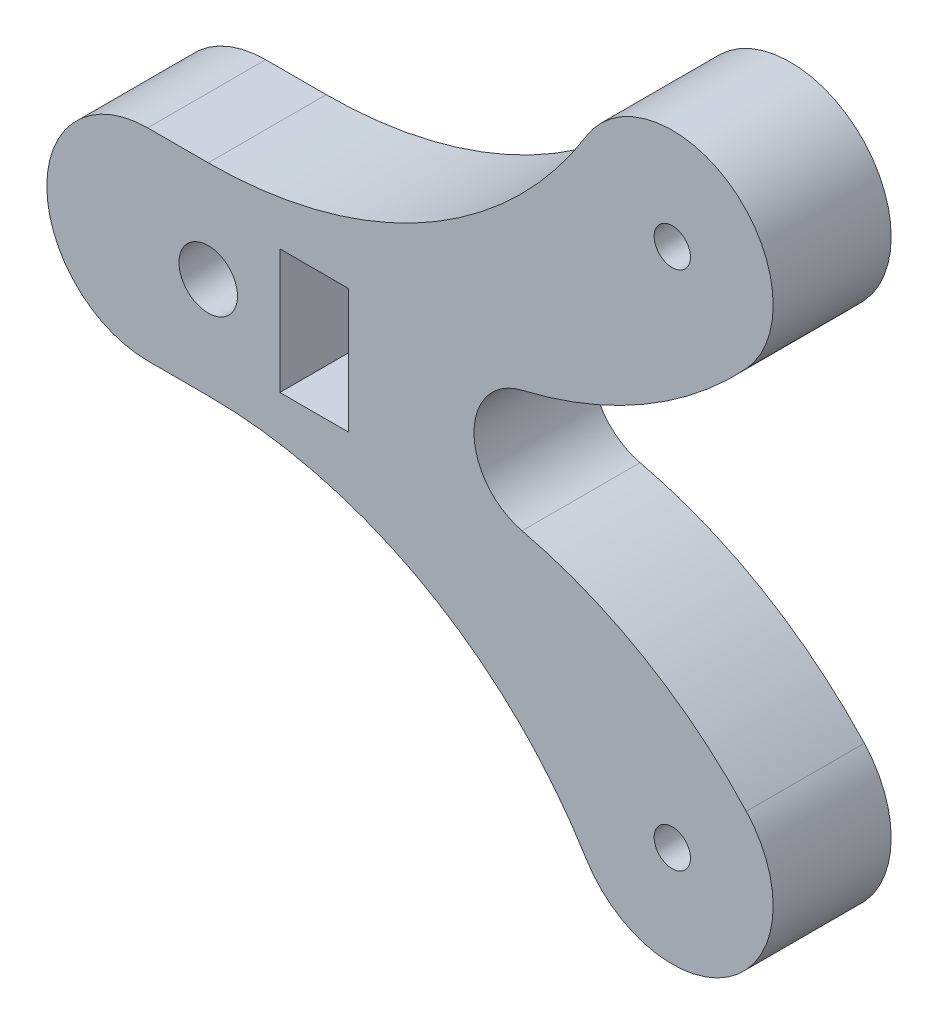
ISO-10303-21;
HEADER;
FILE_DESCRIPTION(('STEP AP214'),'2;1');
FILE_NAME('part.step','',(''),(''),'','','');
FILE_SCHEMA(('AUTOMOTIVE_DESIGN { 1 0 10303 214 1 1 1 1 }'));
ENDSEC;
DATA;
#1=APPLICATION_CONTEXT('core data for automotive mechanical design processes');
#2=APPLICATION_PROTOCOL_DEFINITION('international standard','automotive_design',2000,#1);
#3=PRODUCT_CONTEXT('',#1,'mechanical');
#4=PRODUCT('Part','Part','',(#3));
#5=PRODUCT_RELATED_PRODUCT_CATEGORY('part','',(#4));
#6=PRODUCT_DEFINITION_FORMATION('','',#4);
#7=PRODUCT_DEFINITION_CONTEXT('part definition',#1,'design');
#8=PRODUCT_DEFINITION('design','',#6,#7);
#9=PRODUCT_DEFINITION_SHAPE('','',#8);
#10=(LENGTH_UNIT() NAMED_UNIT(*) SI_UNIT(.MILLI.,.METRE.));
#11=(NAMED_UNIT(*) PLANE_ANGLE_UNIT() SI_UNIT($,.RADIAN.));
#12=(NAMED_UNIT(*) SI_UNIT($,.STERADIAN.) SOLID_ANGLE_UNIT());
#13=UNCERTAINTY_MEASURE_WITH_UNIT(LENGTH_MEASURE(1.E-05),#10,'distance_accuracy_value','');
#14=(GEOMETRIC_REPRESENTATION_CONTEXT(3) GLOBAL_UNCERTAINTY_ASSIGNED_CONTEXT((#13)) GLOBAL_UNIT_ASSIGNED_CONTEXT((#10,
#11,#12)) REPRESENTATION_CONTEXT('',''));
#15=CARTESIAN_POINT('',(0.,0.,0.));
#16=DIRECTION('',(0.,0.,1.));
#17=DIRECTION('',(1.,0.,0.));
#18=AXIS2_PLACEMENT_3D('',#15,#16,#17);
#19=CARTESIAN_POINT('',(588.919699582057,408.411933023014,5.85));
#20=DIRECTION('',(0.,0.,-1.));
#21=DIRECTION('',(-1.,0.,0.));
#22=AXIS2_PLACEMENT_3D('',#19,#20,#21);
#23=PLANE('',#22);
#24=CARTESIAN_POINT('',(588.919699582057,435.365819013464,5.85));
#25=DIRECTION('',(0.,0.,1.));
#26=DIRECTION('',(1.,0.,0.));
#27=AXIS2_PLACEMENT_3D('',#24,#25,#26);
#28=CIRCLE('',#27,1.44981300000002);
#29=CARTESIAN_POINT('',(590.369512582057,435.365819013464,5.85));
#30=VERTEX_POINT('',#29);
#31=EDGE_CURVE('E172',#30,#30,#28,.T.);
#32=ORIENTED_EDGE('',*,*,#31,.F.);
#33=EDGE_LOOP('',(#32));
#34=FACE_BOUND('',#33,.T.);
#35=CARTESIAN_POINT('',(611.919699582057,448.265819013464,5.85));
#36=DIRECTION('',(0.,0.,1.));
#37=DIRECTION('',(1.,0.,0.));
#38=AXIS2_PLACEMENT_3D('',#35,#36,#37);
#39=CIRCLE('',#38,0.900000000000007);
#40=CARTESIAN_POINT('',(612.819699582057,448.265819013464,5.85));
#41=VERTEX_POINT('',#40);
#42=EDGE_CURVE('E184',#41,#41,#39,.T.);
#43=ORIENTED_EDGE('',*,*,#42,.F.);
#44=EDGE_LOOP('',(#43));
#45=FACE_BOUND('',#44,.T.);
#46=CARTESIAN_POINT('',(588.919699582057,408.411933023014,5.85));
#47=DIRECTION('',(0.,0.,-1.));
#48=DIRECTION('',(-1.,0.,0.));
#49=AXIS2_PLACEMENT_3D('',#46,#47,#48);
#50=CIRCLE('',#49,21.9538859904498);
#51=CARTESIAN_POINT('',(588.919699582057,430.365819013464,5.85));
#52=VERTEX_POINT('',#51);
#53=CARTESIAN_POINT('',(607.649897060832,419.864129864134,5.85));
#54=VERTEX_POINT('',#53);
#55=EDGE_CURVE('E190',#52,#54,#50,.T.);
#56=ORIENTED_EDGE('',*,*,#55,.T.);
#57=CARTESIAN_POINT('',(611.919699582057,422.465819013464,5.85));
#58=DIRECTION('',(0.,0.,1.));
#59=DIRECTION('',(1.,0.,0.));
#60=AXIS2_PLACEMENT_3D('',#57,#58,#59);
#61=CIRCLE('',#60,4.99999999999998);
#62=CARTESIAN_POINT('',(615.588112307928,425.863281018059,5.85));
#63=VERTEX_POINT('',#62);
#64=EDGE_CURVE('E193',#54,#63,#61,.T.);
#65=ORIENTED_EDGE('',*,*,#64,.T.);
#66=CARTESIAN_POINT('',(599.373615384666,410.846394605062,5.85));
#67=DIRECTION('',(0.,0.,1.));
#68=DIRECTION('',(-1.,0.,0.));
#69=AXIS2_PLACEMENT_3D('',#66,#67,#68);
#70=CIRCLE('',#69,22.1001535744733);
#71=CARTESIAN_POINT('',(604.475645294501,432.349558995785,5.85));
#72=VERTEX_POINT('',#71);
#73=EDGE_CURVE('E196',#63,#72,#70,.T.);
#74=ORIENTED_EDGE('',*,*,#73,.T.);
#75=CARTESIAN_POINT('',(605.191309675167,435.365819013464,5.85));
#76=DIRECTION('',(0.,0.,-1.));
#77=DIRECTION('',(1.,0.,0.));
#78=AXIS2_PLACEMENT_3D('',#75,#76,#77);
#79=CIRCLE('',#78,3.10000000000006);
#80=CARTESIAN_POINT('',(604.475645294501,438.382079031142,5.85));
#81=VERTEX_POINT('',#80);
#82=EDGE_CURVE('E198',#72,#81,#79,.T.);
#83=ORIENTED_EDGE('',*,*,#82,.T.);
#84=CARTESIAN_POINT('',(599.373615384666,459.885243421865,5.85));
#85=DIRECTION('',(0.,0.,1.));
#86=DIRECTION('',(1.,0.,0.));
#87=AXIS2_PLACEMENT_3D('',#84,#85,#86);
#88=CIRCLE('',#87,22.1001535744733);
#89=CARTESIAN_POINT('',(615.588112307928,444.868357008869,5.85));
#90=VERTEX_POINT('',#89);
#91=EDGE_CURVE('E200',#81,#90,#88,.T.);
#92=ORIENTED_EDGE('',*,*,#91,.T.);
#93=CARTESIAN_POINT('',(611.919699582057,448.265819013464,5.85));
#94=DIRECTION('',(0.,0.,1.));
#95=DIRECTION('',(-1.,0.,0.));
#96=AXIS2_PLACEMENT_3D('',#93,#94,#95);
#97=CIRCLE('',#96,4.99999999999998);
#98=CARTESIAN_POINT('',(607.649897060832,450.867508162793,5.85));
#99=VERTEX_POINT('',#98);
#100=EDGE_CURVE('E202',#90,#99,#97,.T.);
#101=ORIENTED_EDGE('',*,*,#100,.T.);
#102=CARTESIAN_POINT('',(588.919699582057,462.319705003914,5.85));
#103=DIRECTION('',(0.,0.,-1.));
#104=DIRECTION('',(1.,0.,0.));
#105=AXIS2_PLACEMENT_3D('',#102,#103,#104);
#106=CIRCLE('',#105,21.9538859904498);
#107=CARTESIAN_POINT('',(588.919699582057,440.365819013464,5.85));
#108=VERTEX_POINT('',#107);
#109=EDGE_CURVE('E204',#99,#108,#106,.T.);
#110=ORIENTED_EDGE('',*,*,#109,.T.);
#111=DIRECTION('',(-1.,0.,0.));
#112=VECTOR('',#111,1.);
#113=CARTESIAN_POINT('',(588.919699582057,440.365819013464,5.85));
#114=LINE('',#113,#112);
#115=CARTESIAN_POINT('',(585.919699582057,440.365819013464,5.85));
#116=VERTEX_POINT('',#115);
#117=EDGE_CURVE('E206',#108,#116,#114,.T.);
#118=ORIENTED_EDGE('',*,*,#117,.T.);
#119=CARTESIAN_POINT('',(585.919699582057,435.365819013464,5.85));
#120=DIRECTION('',(0.,0.,1.));
#121=DIRECTION('',(1.,0.,0.));
#122=AXIS2_PLACEMENT_3D('',#119,#120,#121);
#123=CIRCLE('',#122,5.);
#124=CARTESIAN_POINT('',(585.919699582057,430.365819013464,5.85));
#125=VERTEX_POINT('',#124);
#126=EDGE_CURVE('E208',#116,#125,#123,.T.);
#127=ORIENTED_EDGE('',*,*,#126,.T.);
#128=DIRECTION('',(1.,0.,0.));
#129=VECTOR('',#128,1.);
#130=CARTESIAN_POINT('',(588.919699582057,430.365819013464,5.85));
#131=LINE('',#130,#129);
#132=EDGE_CURVE('E210',#125,#52,#131,.T.);
#133=ORIENTED_EDGE('',*,*,#132,.T.);
#134=EDGE_LOOP('',(#56,#65,#74,#83,#92,#101,#110,#118,#127,#133));
#135=FACE_BOUND('',#134,.T.);
#136=CARTESIAN_POINT('',(611.919699582057,422.465819013464,5.85));
#137=DIRECTION('',(0.,0.,1.));
#138=DIRECTION('',(1.,0.,0.));
#139=AXIS2_PLACEMENT_3D('',#136,#137,#138);
#140=CIRCLE('',#139,0.900000000000007);
#141=CARTESIAN_POINT('',(612.819699582057,422.465819013464,5.85));
#142=VERTEX_POINT('',#141);
#143=EDGE_CURVE('E178',#142,#142,#140,.T.);
#144=ORIENTED_EDGE('',*,*,#143,.F.);
#145=EDGE_LOOP('',(#144));
#146=FACE_BOUND('',#145,.T.);
#147=DIRECTION('',(0.,-1.,0.));
#148=VECTOR('',#147,1.);
#149=CARTESIAN_POINT('',(592.469512582057,432.283319013464,5.85));
#150=LINE('',#149,#148);
#151=CARTESIAN_POINT('',(592.469512582057,438.448319013464,5.85));
#152=VERTEX_POINT('',#151);
#153=CARTESIAN_POINT('',(592.469512582057,432.283319013464,5.85));
#154=VERTEX_POINT('',#153);
#155=EDGE_CURVE('E136',#152,#154,#150,.T.);
#156=ORIENTED_EDGE('',*,*,#155,.F.);
#157=DIRECTION('',(-1.,0.,0.));
#158=VECTOR('',#157,1.);
#159=CARTESIAN_POINT('',(592.469512582057,438.448319013464,5.85));
#160=LINE('',#159,#158);
#161=CARTESIAN_POINT('',(595.869523582057,438.448319013464,5.85));
#162=VERTEX_POINT('',#161);
#163=EDGE_CURVE('E158',#162,#152,#160,.T.);
#164=ORIENTED_EDGE('',*,*,#163,.F.);
#165=DIRECTION('',(0.,1.,0.));
#166=VECTOR('',#165,1.);
#167=CARTESIAN_POINT('',(595.869523582057,438.448319013464,5.85));
#168=LINE('',#167,#166);
#169=CARTESIAN_POINT('',(595.869523582057,432.283319013464,5.85));
#170=VERTEX_POINT('',#169);
#171=EDGE_CURVE('E156',#170,#162,#168,.T.);
#172=ORIENTED_EDGE('',*,*,#171,.F.);
#173=DIRECTION('',(1.,0.,0.));
#174=VECTOR('',#173,1.);
#175=CARTESIAN_POINT('',(595.869523582057,432.283319013464,5.85));
#176=LINE('',#175,#174);
#177=EDGE_CURVE('E144',#154,#170,#176,.T.);
#178=ORIENTED_EDGE('',*,*,#177,.F.);
#179=EDGE_LOOP('',(#156,#164,#172,#178));
#180=FACE_BOUND('',#179,.T.);
#181=ADVANCED_FACE('F35',(#34,#45,#135,#146,#180),#23,.F.);
#182=CARTESIAN_POINT('',(588.919699582057,408.411933023014,0.));
#183=DIRECTION('',(0.,0.,-1.));
#184=DIRECTION('',(-1.,0.,0.));
#185=AXIS2_PLACEMENT_3D('',#182,#183,#184);
#186=PLANE('',#185);
#187=CARTESIAN_POINT('',(588.919699582057,435.365819013464,0.));
#188=DIRECTION('',(0.,0.,1.));
#189=DIRECTION('',(1.,0.,0.));
#190=AXIS2_PLACEMENT_3D('',#187,#188,#189);
#191=CIRCLE('',#190,1.44981300000002);
#192=CARTESIAN_POINT('',(590.369512582057,435.365819013464,0.));
#193=VERTEX_POINT('',#192);
#194=EDGE_CURVE('E152',#193,#193,#191,.T.);
#195=ORIENTED_EDGE('',*,*,#194,.T.);
#196=EDGE_LOOP('',(#195));
#197=FACE_BOUND('',#196,.T.);
#198=CARTESIAN_POINT('',(611.919699582057,448.265819013464,0.));
#199=DIRECTION('',(0.,0.,1.));
#200=DIRECTION('',(1.,0.,0.));
#201=AXIS2_PLACEMENT_3D('',#198,#199,#200);
#202=CIRCLE('',#201,0.900000000000007);
#203=CARTESIAN_POINT('',(612.819699582057,448.265819013464,0.));
#204=VERTEX_POINT('',#203);
#205=EDGE_CURVE('E181',#204,#204,#202,.T.);
#206=ORIENTED_EDGE('',*,*,#205,.T.);
#207=EDGE_LOOP('',(#206));
#208=FACE_BOUND('',#207,.T.);
#209=CARTESIAN_POINT('',(588.919699582057,408.411933023014,0.));
#210=DIRECTION('',(0.,0.,-1.));
#211=DIRECTION('',(-1.,0.,0.));
#212=AXIS2_PLACEMENT_3D('',#209,#210,#211);
#213=CIRCLE('',#212,21.9538859904498);
#214=CARTESIAN_POINT('',(588.919699582057,430.365819013464,0.));
#215=VERTEX_POINT('',#214);
#216=CARTESIAN_POINT('',(607.649897060832,419.864129864134,0.));
#217=VERTEX_POINT('',#216);
#218=EDGE_CURVE('E187',#215,#217,#213,.T.);
#219=ORIENTED_EDGE('',*,*,#218,.F.);
#220=DIRECTION('',(1.,0.,0.));
#221=VECTOR('',#220,1.);
#222=CARTESIAN_POINT('',(588.919699582057,430.365819013464,0.));
#223=LINE('',#222,#221);
#224=CARTESIAN_POINT('',(585.919699582057,430.365819013464,0.));
#225=VERTEX_POINT('',#224);
#226=EDGE_CURVE('E194',#225,#215,#223,.T.);
#227=ORIENTED_EDGE('',*,*,#226,.F.);
#228=CARTESIAN_POINT('',(585.919699582057,435.365819013464,0.));
#229=DIRECTION('',(0.,0.,1.));
#230=DIRECTION('',(1.,0.,0.));
#231=AXIS2_PLACEMENT_3D('',#228,#229,#230);
#232=CIRCLE('',#231,5.);
#233=CARTESIAN_POINT('',(585.919699582057,440.365819013464,0.));
#234=VERTEX_POINT('',#233);
#235=EDGE_CURVE('E229',#234,#225,#232,.T.);
#236=ORIENTED_EDGE('',*,*,#235,.F.);
#237=DIRECTION('',(-1.,0.,0.));
#238=VECTOR('',#237,1.);
#239=CARTESIAN_POINT('',(588.919699582057,440.365819013464,0.));
#240=LINE('',#239,#238);
#241=CARTESIAN_POINT('',(588.919699582057,440.365819013464,0.));
#242=VERTEX_POINT('',#241);
#243=EDGE_CURVE('E227',#242,#234,#240,.T.);
#244=ORIENTED_EDGE('',*,*,#243,.F.);
#245=CARTESIAN_POINT('',(588.919699582057,462.319705003914,0.));
#246=DIRECTION('',(0.,0.,-1.));
#247=DIRECTION('',(1.,0.,0.));
#248=AXIS2_PLACEMENT_3D('',#245,#246,#247);
#249=CIRCLE('',#248,21.9538859904498);
#250=CARTESIAN_POINT('',(607.649897060832,450.867508162793,0.));
#251=VERTEX_POINT('',#250);
#252=EDGE_CURVE('E225',#251,#242,#249,.T.);
#253=ORIENTED_EDGE('',*,*,#252,.F.);
#254=CARTESIAN_POINT('',(611.919699582057,448.265819013464,0.));
#255=DIRECTION('',(0.,0.,1.));
#256=DIRECTION('',(-1.,0.,0.));
#257=AXIS2_PLACEMENT_3D('',#254,#255,#256);
#258=CIRCLE('',#257,4.99999999999998);
#259=CARTESIAN_POINT('',(615.588112307928,444.868357008869,0.));
#260=VERTEX_POINT('',#259);
#261=EDGE_CURVE('E223',#260,#251,#258,.T.);
#262=ORIENTED_EDGE('',*,*,#261,.F.);
#263=CARTESIAN_POINT('',(599.373615384666,459.885243421865,0.));
#264=DIRECTION('',(0.,0.,1.));
#265=DIRECTION('',(1.,0.,0.));
#266=AXIS2_PLACEMENT_3D('',#263,#264,#265);
#267=CIRCLE('',#266,22.1001535744733);
#268=CARTESIAN_POINT('',(604.475645294501,438.382079031142,0.));
#269=VERTEX_POINT('',#268);
#270=EDGE_CURVE('E221',#269,#260,#267,.T.);
#271=ORIENTED_EDGE('',*,*,#270,.F.);
#272=CARTESIAN_POINT('',(605.191309675167,435.365819013464,0.));
#273=DIRECTION('',(0.,0.,-1.));
#274=DIRECTION('',(1.,0.,0.));
#275=AXIS2_PLACEMENT_3D('',#272,#273,#274);
#276=CIRCLE('',#275,3.10000000000006);
#277=CARTESIAN_POINT('',(604.475645294501,432.349558995785,0.));
#278=VERTEX_POINT('',#277);
#279=EDGE_CURVE('E219',#278,#269,#276,.T.);
#280=ORIENTED_EDGE('',*,*,#279,.F.);
#281=CARTESIAN_POINT('',(599.373615384666,410.846394605062,0.));
#282=DIRECTION('',(0.,0.,1.));
#283=DIRECTION('',(-1.,0.,0.));
#284=AXIS2_PLACEMENT_3D('',#281,#282,#283);
#285=CIRCLE('',#284,22.1001535744733);
#286=CARTESIAN_POINT('',(615.588112307928,425.863281018059,0.));
#287=VERTEX_POINT('',#286);
#288=EDGE_CURVE('E217',#287,#278,#285,.T.);
#289=ORIENTED_EDGE('',*,*,#288,.F.);
#290=CARTESIAN_POINT('',(611.919699582057,422.465819013464,0.));
#291=DIRECTION('',(0.,0.,1.));
#292=DIRECTION('',(1.,0.,0.));
#293=AXIS2_PLACEMENT_3D('',#290,#291,#292);
#294=CIRCLE('',#293,4.99999999999998);
#295=EDGE_CURVE('E215',#217,#287,#294,.T.);
#296=ORIENTED_EDGE('',*,*,#295,.F.);
#297=EDGE_LOOP('',(#219,#227,#236,#244,#253,#262,#271,#280,#289,#296));
#298=FACE_BOUND('',#297,.T.);
#299=CARTESIAN_POINT('',(611.919699582057,422.465819013464,0.));
#300=DIRECTION('',(0.,0.,1.));
#301=DIRECTION('',(1.,0.,0.));
#302=AXIS2_PLACEMENT_3D('',#299,#300,#301);
#303=CIRCLE('',#302,0.900000000000007);
#304=CARTESIAN_POINT('',(612.819699582057,422.465819013464,0.));
#305=VERTEX_POINT('',#304);
#306=EDGE_CURVE('E175',#305,#305,#303,.T.);
#307=ORIENTED_EDGE('',*,*,#306,.T.);
#308=EDGE_LOOP('',(#307));
#309=FACE_BOUND('',#308,.T.);
#310=DIRECTION('',(-1.,0.,0.));
#311=VECTOR('',#310,1.);
#312=CARTESIAN_POINT('',(592.469512582057,438.448319013464,0.));
#313=LINE('',#312,#311);
#314=CARTESIAN_POINT('',(595.869523582057,438.448319013464,0.));
#315=VERTEX_POINT('',#314);
#316=CARTESIAN_POINT('',(592.469512582057,438.448319013464,0.));
#317=VERTEX_POINT('',#316);
#318=EDGE_CURVE('E145',#315,#317,#313,.T.);
#319=ORIENTED_EDGE('',*,*,#318,.T.);
#320=DIRECTION('',(0.,-1.,0.));
#321=VECTOR('',#320,1.);
#322=CARTESIAN_POINT('',(592.469512582057,432.283319013464,0.));
#323=LINE('',#322,#321);
#324=CARTESIAN_POINT('',(592.469512582057,432.283319013464,0.));
#325=VERTEX_POINT('',#324);
#326=EDGE_CURVE('E58',#317,#325,#323,.T.);
#327=ORIENTED_EDGE('',*,*,#326,.T.);
#328=DIRECTION('',(1.,0.,0.));
#329=VECTOR('',#328,1.);
#330=CARTESIAN_POINT('',(595.869523582057,432.283319013464,0.));
#331=LINE('',#330,#329);
#332=CARTESIAN_POINT('',(595.869523582057,432.283319013464,0.));
#333=VERTEX_POINT('',#332);
#334=EDGE_CURVE('E151',#325,#333,#331,.T.);
#335=ORIENTED_EDGE('',*,*,#334,.T.);
#336=DIRECTION('',(0.,1.,0.));
#337=VECTOR('',#336,1.);
#338=CARTESIAN_POINT('',(595.869523582057,438.448319013464,0.));
#339=LINE('',#338,#337);
#340=EDGE_CURVE('E164',#333,#315,#339,.T.);
#341=ORIENTED_EDGE('',*,*,#340,.T.);
#342=EDGE_LOOP('',(#319,#327,#335,#341));
#343=FACE_BOUND('',#342,.T.);
#344=ADVANCED_FACE('F265',(#197,#208,#298,#309,#343),#186,.T.);
#345=CARTESIAN_POINT('',(588.919699582057,408.411933023014,5.85));
#346=DIRECTION('',(0.,0.,-1.));
#347=DIRECTION('',(-1.,0.,0.));
#348=AXIS2_PLACEMENT_3D('',#345,#346,#347);
#349=CYLINDRICAL_SURFACE('',#348,21.9538859904498);
#350=ORIENTED_EDGE('',*,*,#218,.T.);
#351=DIRECTION('',(0.,0.,-1.));
#352=VECTOR('',#351,1.);
#353=CARTESIAN_POINT('',(607.649897060832,419.864129864134,5.85));
#354=LINE('',#353,#352);
#355=EDGE_CURVE('E11',#54,#217,#354,.T.);
#356=ORIENTED_EDGE('',*,*,#355,.F.);
#357=ORIENTED_EDGE('',*,*,#55,.F.);
#358=DIRECTION('',(0.,0.,-1.));
#359=VECTOR('',#358,1.);
#360=CARTESIAN_POINT('',(588.919699582057,430.365819013464,5.85));
#361=LINE('',#360,#359);
#362=EDGE_CURVE('E212',#52,#215,#361,.T.);
#363=ORIENTED_EDGE('',*,*,#362,.T.);
#364=EDGE_LOOP('',(#350,#356,#357,#363));
#365=FACE_BOUND('',#364,.T.);
#366=ADVANCED_FACE('F37',(#365),#349,.F.);
#367=CARTESIAN_POINT('',(611.919699582057,422.465819013464,5.85));
#368=DIRECTION('',(0.,0.,-1.));
#369=DIRECTION('',(-1.,0.,0.));
#370=AXIS2_PLACEMENT_3D('',#367,#368,#369);
#371=CYLINDRICAL_SURFACE('',#370,4.99999999999998);
#372=ORIENTED_EDGE('',*,*,#295,.T.);
#373=DIRECTION('',(0.,0.,-1.));
#374=VECTOR('',#373,1.);
#375=CARTESIAN_POINT('',(615.588112307928,425.863281018059,5.85));
#376=LINE('',#375,#374);
#377=EDGE_CURVE('E43',#63,#287,#376,.T.);
#378=ORIENTED_EDGE('',*,*,#377,.F.);
#379=ORIENTED_EDGE('',*,*,#64,.F.);
#380=ORIENTED_EDGE('',*,*,#355,.T.);
#381=EDGE_LOOP('',(#372,#378,#379,#380));
#382=FACE_BOUND('',#381,.T.);
#383=ADVANCED_FACE('F283',(#382),#371,.T.);
#384=CARTESIAN_POINT('',(599.373615384666,410.846394605062,5.85));
#385=DIRECTION('',(0.,0.,-1.));
#386=DIRECTION('',(-1.,0.,0.));
#387=AXIS2_PLACEMENT_3D('',#384,#385,#386);
#388=CYLINDRICAL_SURFACE('',#387,22.1001535744733);
#389=ORIENTED_EDGE('',*,*,#288,.T.);
#390=DIRECTION('',(0.,0.,-1.));
#391=VECTOR('',#390,1.);
#392=CARTESIAN_POINT('',(604.475645294501,432.349558995785,5.85));
#393=LINE('',#392,#391);
#394=EDGE_CURVE('E252',#72,#278,#393,.T.);
#395=ORIENTED_EDGE('',*,*,#394,.F.);
#396=ORIENTED_EDGE('',*,*,#73,.F.);
#397=ORIENTED_EDGE('',*,*,#377,.T.);
#398=EDGE_LOOP('',(#389,#395,#396,#397));
#399=FACE_BOUND('',#398,.T.);
#400=ADVANCED_FACE('F259',(#399),#388,.T.);
#401=CARTESIAN_POINT('',(605.191309675167,435.365819013464,5.85));
#402=DIRECTION('',(0.,0.,-1.));
#403=DIRECTION('',(-1.,0.,0.));
#404=AXIS2_PLACEMENT_3D('',#401,#402,#403);
#405=CYLINDRICAL_SURFACE('',#404,3.10000000000006);
#406=ORIENTED_EDGE('',*,*,#279,.T.);
#407=DIRECTION('',(0.,0.,-1.));
#408=VECTOR('',#407,1.);
#409=CARTESIAN_POINT('',(604.475645294501,438.382079031142,5.85));
#410=LINE('',#409,#408);
#411=EDGE_CURVE('E249',#81,#269,#410,.T.);
#412=ORIENTED_EDGE('',*,*,#411,.F.);
#413=ORIENTED_EDGE('',*,*,#82,.F.);
#414=ORIENTED_EDGE('',*,*,#394,.T.);
#415=EDGE_LOOP('',(#406,#412,#413,#414));
#416=FACE_BOUND('',#415,.T.);
#417=ADVANCED_FACE('F271',(#416),#405,.F.);
#418=CARTESIAN_POINT('',(599.373615384666,459.885243421865,5.85));
#419=DIRECTION('',(0.,0.,-1.));
#420=DIRECTION('',(-1.,0.,0.));
#421=AXIS2_PLACEMENT_3D('',#418,#419,#420);
#422=CYLINDRICAL_SURFACE('',#421,22.1001535744733);
#423=ORIENTED_EDGE('',*,*,#270,.T.);
#424=DIRECTION('',(0.,0.,-1.));
#425=VECTOR('',#424,1.);
#426=CARTESIAN_POINT('',(615.588112307928,444.868357008869,5.85));
#427=LINE('',#426,#425);
#428=EDGE_CURVE('E246',#90,#260,#427,.T.);
#429=ORIENTED_EDGE('',*,*,#428,.F.);
#430=ORIENTED_EDGE('',*,*,#91,.F.);
#431=ORIENTED_EDGE('',*,*,#411,.T.);
#432=EDGE_LOOP('',(#423,#429,#430,#431));
#433=FACE_BOUND('',#432,.T.);
#434=ADVANCED_FACE('F275',(#433),#422,.T.);
#435=CARTESIAN_POINT('',(611.919699582057,448.265819013464,5.85));
#436=DIRECTION('',(0.,0.,-1.));
#437=DIRECTION('',(-1.,0.,0.));
#438=AXIS2_PLACEMENT_3D('',#435,#436,#437);
#439=CYLINDRICAL_SURFACE('',#438,4.99999999999998);
#440=ORIENTED_EDGE('',*,*,#261,.T.);
#441=DIRECTION('',(0.,0.,-1.));
#442=VECTOR('',#441,1.);
#443=CARTESIAN_POINT('',(607.649897060832,450.867508162793,5.85));
#444=LINE('',#443,#442);
#445=EDGE_CURVE('E243',#99,#251,#444,.T.);
#446=ORIENTED_EDGE('',*,*,#445,.F.);
#447=ORIENTED_EDGE('',*,*,#100,.F.);
#448=ORIENTED_EDGE('',*,*,#428,.T.);
#449=EDGE_LOOP('',(#440,#446,#447,#448));
#450=FACE_BOUND('',#449,.T.);
#451=ADVANCED_FACE('F306',(#450),#439,.T.);
#452=CARTESIAN_POINT('',(588.919699582057,462.319705003914,5.85));
#453=DIRECTION('',(0.,0.,-1.));
#454=DIRECTION('',(-1.,0.,0.));
#455=AXIS2_PLACEMENT_3D('',#452,#453,#454);
#456=CYLINDRICAL_SURFACE('',#455,21.9538859904498);
#457=ORIENTED_EDGE('',*,*,#252,.T.);
#458=DIRECTION('',(0.,0.,-1.));
#459=VECTOR('',#458,1.);
#460=CARTESIAN_POINT('',(588.919699582057,440.365819013464,5.85));
#461=LINE('',#460,#459);
#462=EDGE_CURVE('E240',#108,#242,#461,.T.);
#463=ORIENTED_EDGE('',*,*,#462,.F.);
#464=ORIENTED_EDGE('',*,*,#109,.F.);
#465=ORIENTED_EDGE('',*,*,#445,.T.);
#466=EDGE_LOOP('',(#457,#463,#464,#465));
#467=FACE_BOUND('',#466,.T.);
#468=ADVANCED_FACE('F303',(#467),#456,.F.);
#469=CARTESIAN_POINT('',(588.919699582057,440.365819013464,5.85));
#470=DIRECTION('',(0.,-1.,0.));
#471=DIRECTION('',(0.,0.,-1.));
#472=AXIS2_PLACEMENT_3D('',#469,#470,#471);
#473=PLANE('',#472);
#474=ORIENTED_EDGE('',*,*,#243,.T.);
#475=DIRECTION('',(0.,0.,-1.));
#476=VECTOR('',#475,1.);
#477=CARTESIAN_POINT('',(585.919699582057,440.365819013464,5.85));
#478=LINE('',#477,#476);
#479=EDGE_CURVE('E237',#116,#234,#478,.T.);
#480=ORIENTED_EDGE('',*,*,#479,.F.);
#481=ORIENTED_EDGE('',*,*,#117,.F.);
#482=ORIENTED_EDGE('',*,*,#462,.T.);
#483=EDGE_LOOP('',(#474,#480,#481,#482));
#484=FACE_BOUND('',#483,.T.);
#485=ADVANCED_FACE('F299',(#484),#473,.F.);
#486=CARTESIAN_POINT('',(585.919699582057,435.365819013464,5.85));
#487=DIRECTION('',(0.,0.,-1.));
#488=DIRECTION('',(-1.,0.,0.));
#489=AXIS2_PLACEMENT_3D('',#486,#487,#488);
#490=CYLINDRICAL_SURFACE('',#489,5.);
#491=ORIENTED_EDGE('',*,*,#235,.T.);
#492=DIRECTION('',(0.,0.,-1.));
#493=VECTOR('',#492,1.);
#494=CARTESIAN_POINT('',(585.919699582057,430.365819013464,5.85));
#495=LINE('',#494,#493);
#496=EDGE_CURVE('E234',#125,#225,#495,.T.);
#497=ORIENTED_EDGE('',*,*,#496,.F.);
#498=ORIENTED_EDGE('',*,*,#126,.F.);
#499=ORIENTED_EDGE('',*,*,#479,.T.);
#500=EDGE_LOOP('',(#491,#497,#498,#499));
#501=FACE_BOUND('',#500,.T.);
#502=ADVANCED_FACE('F295',(#501),#490,.T.);
#503=CARTESIAN_POINT('',(588.919699582057,430.365819013464,5.85));
#504=DIRECTION('',(0.,1.,0.));
#505=DIRECTION('',(0.,0.,1.));
#506=AXIS2_PLACEMENT_3D('',#503,#504,#505);
#507=PLANE('',#506);
#508=ORIENTED_EDGE('',*,*,#226,.T.);
#509=ORIENTED_EDGE('',*,*,#362,.F.);
#510=ORIENTED_EDGE('',*,*,#132,.F.);
#511=ORIENTED_EDGE('',*,*,#496,.T.);
#512=EDGE_LOOP('',(#508,#509,#510,#511));
#513=FACE_BOUND('',#512,.T.);
#514=ADVANCED_FACE('F290',(#513),#507,.F.);
#515=CARTESIAN_POINT('',(611.919699582057,448.265819013464,5.85));
#516=DIRECTION('',(0.,0.,-1.));
#517=DIRECTION('',(-1.,0.,0.));
#518=AXIS2_PLACEMENT_3D('',#515,#516,#517);
#519=CYLINDRICAL_SURFACE('',#518,0.900000000000007);
#520=ORIENTED_EDGE('',*,*,#42,.T.);
#521=EDGE_LOOP('',(#520));
#522=FACE_BOUND('',#521,.T.);
#523=ORIENTED_EDGE('',*,*,#205,.F.);
#524=EDGE_LOOP('',(#523));
#525=FACE_BOUND('',#524,.T.);
#526=ADVANCED_FACE('F326',(#522,#525),#519,.F.);
#527=CARTESIAN_POINT('',(611.919699582057,422.465819013464,5.85));
#528=DIRECTION('',(0.,0.,-1.));
#529=DIRECTION('',(-1.,0.,0.));
#530=AXIS2_PLACEMENT_3D('',#527,#528,#529);
#531=CYLINDRICAL_SURFACE('',#530,0.900000000000007);
#532=ORIENTED_EDGE('',*,*,#143,.T.);
#533=EDGE_LOOP('',(#532));
#534=FACE_BOUND('',#533,.T.);
#535=ORIENTED_EDGE('',*,*,#306,.F.);
#536=EDGE_LOOP('',(#535));
#537=FACE_BOUND('',#536,.T.);
#538=ADVANCED_FACE('F352',(#534,#537),#531,.F.);
#539=CARTESIAN_POINT('',(588.919699582057,435.365819013464,5.85));
#540=DIRECTION('',(0.,0.,-1.));
#541=DIRECTION('',(-1.,0.,0.));
#542=AXIS2_PLACEMENT_3D('',#539,#540,#541);
#543=CYLINDRICAL_SURFACE('',#542,1.44981300000002);
#544=ORIENTED_EDGE('',*,*,#31,.T.);
#545=EDGE_LOOP('',(#544));
#546=FACE_BOUND('',#545,.T.);
#547=ORIENTED_EDGE('',*,*,#194,.F.);
#548=EDGE_LOOP('',(#547));
#549=FACE_BOUND('',#548,.T.);
#550=ADVANCED_FACE('F359',(#546,#549),#543,.F.);
#551=CARTESIAN_POINT('',(592.469512582057,432.283319013464,5.85));
#552=DIRECTION('',(1.,0.,0.));
#553=DIRECTION('',(0.,0.,-1.));
#554=AXIS2_PLACEMENT_3D('',#551,#552,#553);
#555=PLANE('',#554);
#556=ORIENTED_EDGE('',*,*,#326,.F.);
#557=DIRECTION('',(0.,0.,-1.));
#558=VECTOR('',#557,1.);
#559=CARTESIAN_POINT('',(592.469512582057,438.448319013464,5.85));
#560=LINE('',#559,#558);
#561=EDGE_CURVE('E140',#152,#317,#560,.T.);
#562=ORIENTED_EDGE('',*,*,#561,.F.);
#563=ORIENTED_EDGE('',*,*,#155,.T.);
#564=DIRECTION('',(0.,0.,-1.));
#565=VECTOR('',#564,1.);
#566=CARTESIAN_POINT('',(592.469512582057,432.283319013464,5.85));
#567=LINE('',#566,#565);
#568=EDGE_CURVE('E139',#154,#325,#567,.T.);
#569=ORIENTED_EDGE('',*,*,#568,.T.);
#570=EDGE_LOOP('',(#556,#562,#563,#569));
#571=FACE_BOUND('',#570,.T.);
#572=ADVANCED_FACE('F138',(#571),#555,.T.);
#573=CARTESIAN_POINT('',(595.869523582057,432.283319013464,5.85));
#574=DIRECTION('',(0.,1.,0.));
#575=DIRECTION('',(0.,0.,1.));
#576=AXIS2_PLACEMENT_3D('',#573,#574,#575);
#577=PLANE('',#576);
#578=ORIENTED_EDGE('',*,*,#334,.F.);
#579=ORIENTED_EDGE('',*,*,#568,.F.);
#580=ORIENTED_EDGE('',*,*,#177,.T.);
#581=DIRECTION('',(0.,0.,-1.));
#582=VECTOR('',#581,1.);
#583=CARTESIAN_POINT('',(595.869523582057,432.283319013464,5.85));
#584=LINE('',#583,#582);
#585=EDGE_CURVE('E153',#170,#333,#584,.T.);
#586=ORIENTED_EDGE('',*,*,#585,.T.);
#587=EDGE_LOOP('',(#578,#579,#580,#586));
#588=FACE_BOUND('',#587,.T.);
#589=ADVANCED_FACE('F148',(#588),#577,.T.);
#590=CARTESIAN_POINT('',(595.869523582057,438.448319013464,5.85));
#591=DIRECTION('',(-1.,0.,0.));
#592=DIRECTION('',(0.,0.,1.));
#593=AXIS2_PLACEMENT_3D('',#590,#591,#592);
#594=PLANE('',#593);
#595=ORIENTED_EDGE('',*,*,#340,.F.);
#596=ORIENTED_EDGE('',*,*,#585,.F.);
#597=ORIENTED_EDGE('',*,*,#171,.T.);
#598=DIRECTION('',(0.,0.,-1.));
#599=VECTOR('',#598,1.);
#600=CARTESIAN_POINT('',(595.869523582057,438.448319013464,5.85));
#601=LINE('',#600,#599);
#602=EDGE_CURVE('E50',#162,#315,#601,.T.);
#603=ORIENTED_EDGE('',*,*,#602,.T.);
#604=EDGE_LOOP('',(#595,#596,#597,#603));
#605=FACE_BOUND('',#604,.T.);
#606=ADVANCED_FACE('F379',(#605),#594,.T.);
#607=CARTESIAN_POINT('',(592.469512582057,438.448319013464,5.85));
#608=DIRECTION('',(0.,-1.,0.));
#609=DIRECTION('',(0.,0.,-1.));
#610=AXIS2_PLACEMENT_3D('',#607,#608,#609);
#611=PLANE('',#610);
#612=ORIENTED_EDGE('',*,*,#318,.F.);
#613=ORIENTED_EDGE('',*,*,#602,.F.);
#614=ORIENTED_EDGE('',*,*,#163,.T.);
#615=ORIENTED_EDGE('',*,*,#561,.T.);
#616=EDGE_LOOP('',(#612,#613,#614,#615));
#617=FACE_BOUND('',#616,.T.);
#618=ADVANCED_FACE('F386',(#617),#611,.T.);
#619=CLOSED_SHELL('',(#181,#344,#366,#383,#400,#417,#434,#451,#468,#485,#502,#514,#526,#538,
#550,#572,#589,#606,#618));
#620=MANIFOLD_SOLID_BREP('B2',#619);
#621=ADVANCED_BREP_SHAPE_REPRESENTATION('',(#18,#620),#14);
#622=SHAPE_DEFINITION_REPRESENTATION(#9,#621);
ENDSEC;
END-ISO-10303-21;
